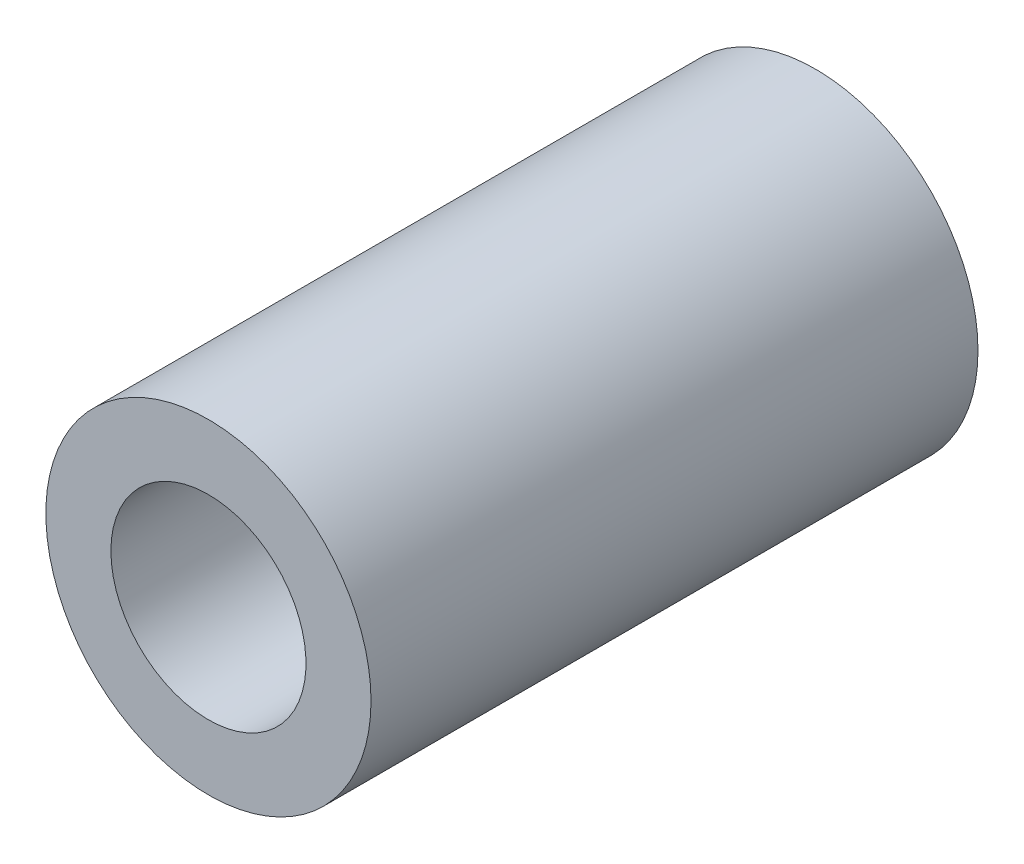
ISO-10303-21;
HEADER;
FILE_DESCRIPTION(('STEP AP214'),'2;1');
FILE_NAME('part.step','',(''),(''),'','','');
FILE_SCHEMA(('AUTOMOTIVE_DESIGN { 1 0 10303 214 1 1 1 1 }'));
ENDSEC;
DATA;
#1=APPLICATION_CONTEXT('core data for automotive mechanical design processes');
#2=APPLICATION_PROTOCOL_DEFINITION('international standard','automotive_design',2000,#1);
#3=PRODUCT_CONTEXT('',#1,'mechanical');
#4=PRODUCT('Part','Part','',(#3));
#5=PRODUCT_RELATED_PRODUCT_CATEGORY('part','',(#4));
#6=PRODUCT_DEFINITION_FORMATION('','',#4);
#7=PRODUCT_DEFINITION_CONTEXT('part definition',#1,'design');
#8=PRODUCT_DEFINITION('design','',#6,#7);
#9=PRODUCT_DEFINITION_SHAPE('','',#8);
#10=(LENGTH_UNIT() NAMED_UNIT(*) SI_UNIT(.MILLI.,.METRE.));
#11=(NAMED_UNIT(*) PLANE_ANGLE_UNIT() SI_UNIT($,.RADIAN.));
#12=(NAMED_UNIT(*) SI_UNIT($,.STERADIAN.) SOLID_ANGLE_UNIT());
#13=UNCERTAINTY_MEASURE_WITH_UNIT(LENGTH_MEASURE(1.E-05),#10,'distance_accuracy_value','');
#14=(GEOMETRIC_REPRESENTATION_CONTEXT(3) GLOBAL_UNCERTAINTY_ASSIGNED_CONTEXT((#13)) GLOBAL_UNIT_ASSIGNED_CONTEXT((#10,
#11,#12)) REPRESENTATION_CONTEXT('',''));
#15=CARTESIAN_POINT('',(0.,0.,0.));
#16=DIRECTION('',(0.,0.,1.));
#17=DIRECTION('',(1.,0.,0.));
#18=AXIS2_PLACEMENT_3D('',#15,#16,#17);
#19=CARTESIAN_POINT('',(-14.5,25.1147367097488,50.0000000000114));
#20=DIRECTION('',(0.,0.,1.));
#21=DIRECTION('',(1.,0.,0.));
#22=AXIS2_PLACEMENT_3D('',#19,#20,#21);
#23=CONICAL_SURFACE('',#22,2.50000000005275,0.674740942265145);
#24=CARTESIAN_POINT('',(-14.5,25.1147367097488,49.5000000000232));
#25=DIRECTION('',(0.,0.,-1.));
#26=DIRECTION('',(-1.,0.,0.));
#27=AXIS2_PLACEMENT_3D('',#24,#25,#26);
#28=CIRCLE('',#27,2.09999999992578);
#29=CARTESIAN_POINT('',(-16.5999999999258,25.1147367097488,49.5000000000232));
#30=VERTEX_POINT('',#29);
#31=EDGE_CURVE('E93',#30,#30,#28,.T.);
#32=ORIENTED_EDGE('',*,*,#31,.T.);
#33=EDGE_LOOP('',(#32));
#34=FACE_BOUND('',#33,.T.);
#35=CARTESIAN_POINT('',(-14.5,25.1147367097488,50.0000000000114));
#36=DIRECTION('',(0.,0.,-1.));
#37=DIRECTION('',(-1.,0.,0.));
#38=AXIS2_PLACEMENT_3D('',#35,#36,#37);
#39=CIRCLE('',#38,2.49999999993907);
#40=CARTESIAN_POINT('',(-16.9999999999391,25.1147367097488,50.0000000000114));
#41=VERTEX_POINT('',#40);
#42=EDGE_CURVE('E88',#41,#41,#39,.F.);
#43=ORIENTED_EDGE('',*,*,#42,.T.);
#44=EDGE_LOOP('',(#43));
#45=FACE_BOUND('',#44,.T.);
#46=ADVANCED_FACE('F15',(#34,#45),#23,.F.);
#47=CARTESIAN_POINT('',(-14.5,25.1147367097488,48.9999999999782));
#48=DIRECTION('',(0.,0.,-1.));
#49=DIRECTION('',(-1.,0.,0.));
#50=AXIS2_PLACEMENT_3D('',#47,#48,#49);
#51=CONICAL_SURFACE('',#50,2.49999999999591,0.674740942265145);
#52=CARTESIAN_POINT('',(-14.5,25.1147367097488,48.9999999999782));
#53=DIRECTION('',(0.,0.,1.));
#54=DIRECTION('',(-1.,0.,0.));
#55=AXIS2_PLACEMENT_3D('',#52,#53,#54);
#56=CIRCLE('',#55,2.49999999999591);
#57=CARTESIAN_POINT('',(-16.9999999999959,25.1147367097488,48.9999999999782));
#58=VERTEX_POINT('',#57);
#59=EDGE_CURVE('E83',#58,#58,#56,.F.);
#60=ORIENTED_EDGE('',*,*,#59,.T.);
#61=EDGE_LOOP('',(#60));
#62=FACE_BOUND('',#61,.T.);
#63=ORIENTED_EDGE('',*,*,#31,.F.);
#64=EDGE_LOOP('',(#63));
#65=FACE_BOUND('',#64,.T.);
#66=ADVANCED_FACE('F100',(#62,#65),#51,.F.);
#67=CARTESIAN_POINT('',(-14.5,25.1147367097488,50.0000000000114));
#68=DIRECTION('',(0.,0.,-1.));
#69=DIRECTION('',(-1.,0.,0.));
#70=AXIS2_PLACEMENT_3D('',#67,#68,#69);
#71=CONICAL_SURFACE('',#70,2.49999999993907,0.67474094218196);
#72=ORIENTED_EDGE('',*,*,#42,.F.);
#73=EDGE_LOOP('',(#72));
#74=FACE_BOUND('',#73,.T.);
#75=CARTESIAN_POINT('',(-14.5,25.1147367097488,50.5));
#76=DIRECTION('',(0.,0.,1.));
#77=DIRECTION('',(-1.,0.,0.));
#78=AXIS2_PLACEMENT_3D('',#75,#76,#77);
#79=CIRCLE('',#78,2.10000000003947);
#80=CARTESIAN_POINT('',(-16.6000000000395,25.1147367097488,50.5));
#81=VERTEX_POINT('',#80);
#82=EDGE_CURVE('E78',#81,#81,#79,.T.);
#83=ORIENTED_EDGE('',*,*,#82,.T.);
#84=EDGE_LOOP('',(#83));
#85=FACE_BOUND('',#84,.T.);
#86=ADVANCED_FACE('F102',(#74,#85),#71,.F.);
#87=CARTESIAN_POINT('',(-14.5,25.1147367097488,48.9999999999782));
#88=DIRECTION('',(0.,0.,1.));
#89=DIRECTION('',(1.,0.,0.));
#90=AXIS2_PLACEMENT_3D('',#87,#88,#89);
#91=CONICAL_SURFACE('',#90,2.49999999999591,0.674740942237417);
#92=CARTESIAN_POINT('',(-14.5,25.1147367097488,48.5000000000468));
#93=DIRECTION('',(0.,0.,-1.));
#94=DIRECTION('',(-1.,0.,0.));
#95=AXIS2_PLACEMENT_3D('',#92,#93,#94);
#96=CIRCLE('',#95,2.09999999992578);
#97=CARTESIAN_POINT('',(-16.5999999999258,25.1147367097488,48.5000000000468));
#98=VERTEX_POINT('',#97);
#99=EDGE_CURVE('E73',#98,#98,#96,.T.);
#100=ORIENTED_EDGE('',*,*,#99,.T.);
#101=EDGE_LOOP('',(#100));
#102=FACE_BOUND('',#101,.T.);
#103=ORIENTED_EDGE('',*,*,#59,.F.);
#104=EDGE_LOOP('',(#103));
#105=FACE_BOUND('',#104,.T.);
#106=ADVANCED_FACE('F110',(#102,#105),#91,.F.);
#107=CARTESIAN_POINT('',(-14.5,25.1147367097488,50.9999999999309));
#108=DIRECTION('',(0.,0.,1.));
#109=DIRECTION('',(0.,-1.,0.));
#110=AXIS2_PLACEMENT_3D('',#107,#108,#109);
#111=CONICAL_SURFACE('',#110,2.49999999999591,0.674740942223553);
#112=ORIENTED_EDGE('',*,*,#82,.F.);
#113=EDGE_LOOP('',(#112));
#114=FACE_BOUND('',#113,.T.);
#115=CARTESIAN_POINT('',(-14.5,25.1147367097488,50.9999999999877));
#116=DIRECTION('',(0.,0.,-1.));
#117=DIRECTION('',(-1.,0.,0.));
#118=AXIS2_PLACEMENT_3D('',#115,#116,#117);
#119=CIRCLE('',#118,2.49999999999591);
#120=CARTESIAN_POINT('',(-16.9999999999959,25.1147367097488,50.9999999999877));
#121=VERTEX_POINT('',#120);
#122=EDGE_CURVE('E68',#121,#121,#119,.F.);
#123=ORIENTED_EDGE('',*,*,#122,.T.);
#124=EDGE_LOOP('',(#123));
#125=FACE_BOUND('',#124,.T.);
#126=ADVANCED_FACE('F162',(#114,#125),#111,.F.);
#127=CARTESIAN_POINT('',(-14.5,25.1147367097488,48.0000000000587));
#128=DIRECTION('',(0.,0.,-1.));
#129=DIRECTION('',(-1.,0.,0.));
#130=AXIS2_PLACEMENT_3D('',#127,#128,#129);
#131=CONICAL_SURFACE('',#130,2.49999999988222,0.674740942195824);
#132=CARTESIAN_POINT('',(-14.5,25.1147367097488,48.0000000000018));
#133=DIRECTION('',(0.,0.,1.));
#134=DIRECTION('',(-1.,0.,0.));
#135=AXIS2_PLACEMENT_3D('',#132,#133,#134);
#136=CIRCLE('',#135,2.49999999993907);
#137=CARTESIAN_POINT('',(-16.9999999999391,25.1147367097488,48.0000000000018));
#138=VERTEX_POINT('',#137);
#139=EDGE_CURVE('E63',#138,#138,#136,.F.);
#140=ORIENTED_EDGE('',*,*,#139,.T.);
#141=EDGE_LOOP('',(#140));
#142=FACE_BOUND('',#141,.T.);
#143=ORIENTED_EDGE('',*,*,#99,.F.);
#144=EDGE_LOOP('',(#143));
#145=FACE_BOUND('',#144,.T.);
#146=ADVANCED_FACE('F158',(#142,#145),#131,.F.);
#147=CARTESIAN_POINT('',(-14.5,25.1147367097488,50.9999999999877));
#148=DIRECTION('',(0.,0.,-1.));
#149=DIRECTION('',(-1.,0.,0.));
#150=AXIS2_PLACEMENT_3D('',#147,#148,#149);
#151=CONICAL_SURFACE('',#150,2.49999999999591,0.674740942265145);
#152=ORIENTED_EDGE('',*,*,#122,.F.);
#153=EDGE_LOOP('',(#152));
#154=FACE_BOUND('',#153,.T.);
#155=CARTESIAN_POINT('',(-14.5,25.1147367097488,51.4999999999759));
#156=DIRECTION('',(0.,0.,1.));
#157=DIRECTION('',(-1.,0.,0.));
#158=AXIS2_PLACEMENT_3D('',#155,#156,#157);
#159=CIRCLE('',#158,2.09999999998263);
#160=CARTESIAN_POINT('',(-16.5999999999826,25.1147367097488,51.4999999999759));
#161=VERTEX_POINT('',#160);
#162=EDGE_CURVE('E58',#161,#161,#159,.T.);
#163=ORIENTED_EDGE('',*,*,#162,.T.);
#164=EDGE_LOOP('',(#163));
#165=FACE_BOUND('',#164,.T.);
#166=ADVANCED_FACE('F154',(#154,#165),#151,.F.);
#167=CARTESIAN_POINT('',(-14.5,25.1147367097488,47.9999999998881));
#168=DIRECTION('',(0.,0.,1.));
#169=DIRECTION('',(1.,0.,0.));
#170=AXIS2_PLACEMENT_3D('',#167,#168,#169);
#171=CONICAL_SURFACE('',#170,2.49999999988222,0.674740942251281);
#172=CARTESIAN_POINT('',(-14.5,25.1147367097488,47.5000000000136));
#173=DIRECTION('',(0.,0.,-1.));
#174=DIRECTION('',(-1.,0.,0.));
#175=AXIS2_PLACEMENT_3D('',#172,#173,#174);
#176=CIRCLE('',#175,2.09999999998263);
#177=CARTESIAN_POINT('',(-16.5999999999826,25.1147367097488,47.5000000000136));
#178=VERTEX_POINT('',#177);
#179=EDGE_CURVE('E50',#178,#178,#176,.T.);
#180=ORIENTED_EDGE('',*,*,#179,.T.);
#181=EDGE_LOOP('',(#180));
#182=FACE_BOUND('',#181,.T.);
#183=ORIENTED_EDGE('',*,*,#139,.F.);
#184=EDGE_LOOP('',(#183));
#185=FACE_BOUND('',#184,.T.);
#186=ADVANCED_FACE('F150',(#182,#185),#171,.F.);
#187=CARTESIAN_POINT('',(-14.5,25.1147367097488,51.9999999999072));
#188=DIRECTION('',(0.,0.,1.));
#189=DIRECTION('',(1.,0.,0.));
#190=AXIS2_PLACEMENT_3D('',#187,#188,#189);
#191=CONICAL_SURFACE('',#190,2.49999999993907,0.674740942195824);
#192=ORIENTED_EDGE('',*,*,#162,.F.);
#193=EDGE_LOOP('',(#192));
#194=FACE_BOUND('',#193,.T.);
#195=CARTESIAN_POINT('',(-14.5,25.1147367097488,52.0000000000209));
#196=DIRECTION('',(0.,0.,1.));
#197=DIRECTION('',(1.,0.,0.));
#198=AXIS2_PLACEMENT_3D('',#195,#196,#197);
#199=CIRCLE('',#198,2.50000000003002);
#200=CARTESIAN_POINT('',(-11.99999999997,25.1147367097488,52.0000000000209));
#201=VERTEX_POINT('',#200);
#202=EDGE_CURVE('E18',#201,#201,#199,.F.);
#203=ORIENTED_EDGE('',*,*,#202,.F.);
#204=EDGE_LOOP('',(#203));
#205=FACE_BOUND('',#204,.T.);
#206=ADVANCED_FACE('F147',(#194,#205),#191,.F.);
#207=CARTESIAN_POINT('',(-14.5,25.1147367097488,47.0000000000823));
#208=DIRECTION('',(0.,0.,-1.));
#209=DIRECTION('',(-1.,0.,0.));
#210=AXIS2_PLACEMENT_3D('',#207,#208,#209);
#211=CONICAL_SURFACE('',#210,2.49999999993907,0.674740942195824);
#212=CARTESIAN_POINT('',(-14.5,25.1147367097488,47.0000000000255));
#213=DIRECTION('',(0.,0.,1.));
#214=DIRECTION('',(-1.,0.,0.));
#215=AXIS2_PLACEMENT_3D('',#212,#213,#214);
#216=CIRCLE('',#215,2.50000000005275);
#217=CARTESIAN_POINT('',(-17.0000000000528,25.1147367097488,47.0000000000255));
#218=VERTEX_POINT('',#217);
#219=EDGE_CURVE('E40',#218,#218,#216,.F.);
#220=ORIENTED_EDGE('',*,*,#219,.T.);
#221=EDGE_LOOP('',(#220));
#222=FACE_BOUND('',#221,.T.);
#223=ORIENTED_EDGE('',*,*,#179,.F.);
#224=EDGE_LOOP('',(#223));
#225=FACE_BOUND('',#224,.T.);
#226=ADVANCED_FACE('F144',(#222,#225),#211,.F.);
#227=CARTESIAN_POINT('',(-14.5,29.6147367097488,52.));
#228=DIRECTION('',(0.,0.,1.));
#229=DIRECTION('',(1.,0.,0.));
#230=AXIS2_PLACEMENT_3D('',#227,#228,#229);
#231=PLANE('',#230);
#232=CARTESIAN_POINT('',(-14.5,25.1147367097488,52.));
#233=DIRECTION('',(0.,0.,-1.));
#234=DIRECTION('',(-1.,0.,0.));
#235=AXIS2_PLACEMENT_3D('',#232,#233,#234);
#236=CIRCLE('',#235,4.5);
#237=CARTESIAN_POINT('',(-19.,25.1147367097488,52.));
#238=VERTEX_POINT('',#237);
#239=EDGE_CURVE('E38',#238,#238,#236,.F.);
#240=ORIENTED_EDGE('',*,*,#239,.T.);
#241=EDGE_LOOP('',(#240));
#242=FACE_BOUND('',#241,.T.);
#243=ORIENTED_EDGE('',*,*,#202,.T.);
#244=EDGE_LOOP('',(#243));
#245=FACE_BOUND('',#244,.T.);
#246=ADVANCED_FACE('F140',(#242,#245),#231,.T.);
#247=CARTESIAN_POINT('',(-14.5,25.1147367097488,46.9999999999118));
#248=DIRECTION('',(0.,0.,1.));
#249=DIRECTION('',(1.,0.,0.));
#250=AXIS2_PLACEMENT_3D('',#247,#248,#249);
#251=CONICAL_SURFACE('',#250,2.49999999993907,0.674740942195824);
#252=CARTESIAN_POINT('',(-14.5,25.1147367097488,46.4999999999236));
#253=DIRECTION('',(0.,0.,-1.));
#254=DIRECTION('',(-1.,0.,0.));
#255=AXIS2_PLACEMENT_3D('',#252,#253,#254);
#256=CIRCLE('',#255,2.09999999998263);
#257=CARTESIAN_POINT('',(-16.5999999999826,25.1147367097488,46.4999999999236));
#258=VERTEX_POINT('',#257);
#259=EDGE_CURVE('E37',#258,#258,#256,.T.);
#260=ORIENTED_EDGE('',*,*,#259,.T.);
#261=EDGE_LOOP('',(#260));
#262=FACE_BOUND('',#261,.T.);
#263=ORIENTED_EDGE('',*,*,#219,.F.);
#264=EDGE_LOOP('',(#263));
#265=FACE_BOUND('',#264,.T.);
#266=ADVANCED_FACE('F136',(#262,#265),#251,.F.);
#267=CARTESIAN_POINT('',(-14.5,25.1147367097488,74.));
#268=DIRECTION('',(0.,0.,-1.));
#269=DIRECTION('',(-1.,0.,0.));
#270=AXIS2_PLACEMENT_3D('',#267,#268,#269);
#271=CYLINDRICAL_SURFACE('',#270,4.5);
#272=CARTESIAN_POINT('',(-14.5,25.1147367097488,74.));
#273=DIRECTION('',(0.,0.,-1.));
#274=DIRECTION('',(-1.,0.,0.));
#275=AXIS2_PLACEMENT_3D('',#272,#273,#274);
#276=CIRCLE('',#275,4.5);
#277=CARTESIAN_POINT('',(-19.,25.1147367097488,74.));
#278=VERTEX_POINT('',#277);
#279=EDGE_CURVE('E35',#278,#278,#276,.T.);
#280=ORIENTED_EDGE('',*,*,#279,.F.);
#281=EDGE_LOOP('',(#280));
#282=FACE_BOUND('',#281,.T.);
#283=ORIENTED_EDGE('',*,*,#239,.F.);
#284=EDGE_LOOP('',(#283));
#285=FACE_BOUND('',#284,.T.);
#286=ADVANCED_FACE('F132',(#282,#285),#271,.F.);
#287=CARTESIAN_POINT('',(-14.5,25.1147367097488,45.9999999999923));
#288=DIRECTION('',(0.,0.,-1.));
#289=DIRECTION('',(-1.,0.,0.));
#290=AXIS2_PLACEMENT_3D('',#287,#288,#289);
#291=CONICAL_SURFACE('',#290,2.49999999993907,0.674740942237417);
#292=CARTESIAN_POINT('',(-14.5,25.1147367097488,45.9999999999923));
#293=DIRECTION('',(0.,0.,-1.));
#294=DIRECTION('',(-1.,0.,0.));
#295=AXIS2_PLACEMENT_3D('',#292,#293,#294);
#296=CIRCLE('',#295,2.49999999993907);
#297=CARTESIAN_POINT('',(-16.9999999999391,25.1147367097488,45.9999999999923));
#298=VERTEX_POINT('',#297);
#299=EDGE_CURVE('E27',#298,#298,#296,.T.);
#300=ORIENTED_EDGE('',*,*,#299,.T.);
#301=EDGE_LOOP('',(#300));
#302=FACE_BOUND('',#301,.T.);
#303=ORIENTED_EDGE('',*,*,#259,.F.);
#304=EDGE_LOOP('',(#303));
#305=FACE_BOUND('',#304,.T.);
#306=ADVANCED_FACE('F128',(#302,#305),#291,.F.);
#307=CARTESIAN_POINT('',(-14.5,32.6147367097488,74.));
#308=DIRECTION('',(0.,0.,1.));
#309=DIRECTION('',(1.,0.,0.));
#310=AXIS2_PLACEMENT_3D('',#307,#308,#309);
#311=PLANE('',#310);
#312=CARTESIAN_POINT('',(-14.5,25.1147367097488,74.));
#313=DIRECTION('',(0.,0.,1.));
#314=DIRECTION('',(1.,0.,0.));
#315=AXIS2_PLACEMENT_3D('',#312,#313,#314);
#316=CIRCLE('',#315,7.5);
#317=CARTESIAN_POINT('',(-7.,25.1147367097488,74.));
#318=VERTEX_POINT('',#317);
#319=EDGE_CURVE('E22',#318,#318,#316,.F.);
#320=ORIENTED_EDGE('',*,*,#319,.F.);
#321=EDGE_LOOP('',(#320));
#322=FACE_BOUND('',#321,.T.);
#323=ORIENTED_EDGE('',*,*,#279,.T.);
#324=EDGE_LOOP('',(#323));
#325=FACE_BOUND('',#324,.T.);
#326=ADVANCED_FACE('F121',(#322,#325),#311,.T.);
#327=CARTESIAN_POINT('',(-14.5,25.1147367097488,46.));
#328=DIRECTION('',(0.,0.,1.));
#329=DIRECTION('',(1.,0.,0.));
#330=AXIS2_PLACEMENT_3D('',#327,#328,#329);
#331=PLANE('',#330);
#332=CARTESIAN_POINT('',(-14.5,25.1147367097488,46.));
#333=DIRECTION('',(0.,0.,1.));
#334=DIRECTION('',(1.,0.,0.));
#335=AXIS2_PLACEMENT_3D('',#332,#333,#334);
#336=CIRCLE('',#335,7.5);
#337=CARTESIAN_POINT('',(-7.,25.1147367097488,46.));
#338=VERTEX_POINT('',#337);
#339=EDGE_CURVE('E10',#338,#338,#336,.T.);
#340=ORIENTED_EDGE('',*,*,#339,.F.);
#341=EDGE_LOOP('',(#340));
#342=FACE_BOUND('',#341,.T.);
#343=ORIENTED_EDGE('',*,*,#299,.F.);
#344=EDGE_LOOP('',(#343));
#345=FACE_BOUND('',#344,.T.);
#346=ADVANCED_FACE('F115',(#342,#345),#331,.F.);
#347=CARTESIAN_POINT('',(-14.5,25.1147367097488,46.));
#348=DIRECTION('',(0.,0.,1.));
#349=DIRECTION('',(1.,0.,0.));
#350=AXIS2_PLACEMENT_3D('',#347,#348,#349);
#351=CYLINDRICAL_SURFACE('',#350,7.5);
#352=ORIENTED_EDGE('',*,*,#339,.T.);
#353=EDGE_LOOP('',(#352));
#354=FACE_BOUND('',#353,.T.);
#355=ORIENTED_EDGE('',*,*,#319,.T.);
#356=EDGE_LOOP('',(#355));
#357=FACE_BOUND('',#356,.T.);
#358=ADVANCED_FACE('F113',(#354,#357),#351,.T.);
#359=CLOSED_SHELL('',(#46,#66,#86,#106,#126,#146,#166,#186,#206,#226,#246,#266,#286,#306,#326,
#346,#358));
#360=MANIFOLD_SOLID_BREP('B1',#359);
#361=ADVANCED_BREP_SHAPE_REPRESENTATION('',(#18,#360),#14);
#362=SHAPE_DEFINITION_REPRESENTATION(#9,#361);
ENDSEC;
END-ISO-10303-21;
